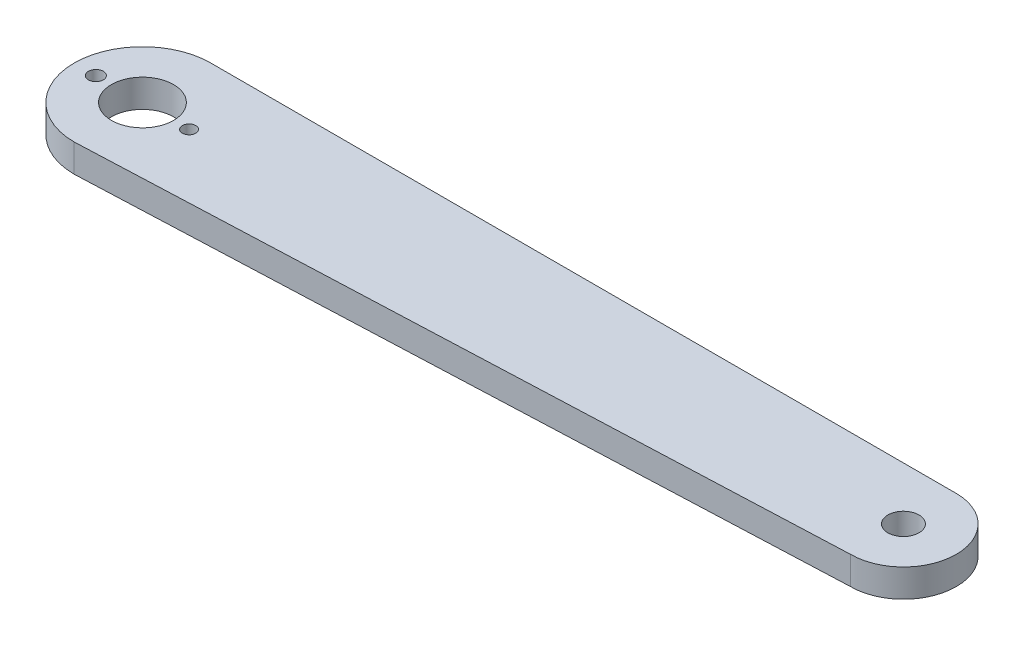
ISO-10303-21;
HEADER;
FILE_DESCRIPTION(('STEP AP214'),'2;1');
FILE_NAME('part.step','',(''),(''),'','','');
FILE_SCHEMA(('AUTOMOTIVE_DESIGN { 1 0 10303 214 1 1 1 1 }'));
ENDSEC;
DATA;
#1=APPLICATION_CONTEXT('core data for automotive mechanical design processes');
#2=APPLICATION_PROTOCOL_DEFINITION('international standard','automotive_design',2000,#1);
#3=PRODUCT_CONTEXT('',#1,'mechanical');
#4=PRODUCT('Part','Part','',(#3));
#5=PRODUCT_RELATED_PRODUCT_CATEGORY('part','',(#4));
#6=PRODUCT_DEFINITION_FORMATION('','',#4);
#7=PRODUCT_DEFINITION_CONTEXT('part definition',#1,'design');
#8=PRODUCT_DEFINITION('design','',#6,#7);
#9=PRODUCT_DEFINITION_SHAPE('','',#8);
#10=(LENGTH_UNIT() NAMED_UNIT(*) SI_UNIT(.MILLI.,.METRE.));
#11=(NAMED_UNIT(*) PLANE_ANGLE_UNIT() SI_UNIT($,.RADIAN.));
#12=(NAMED_UNIT(*) SI_UNIT($,.STERADIAN.) SOLID_ANGLE_UNIT());
#13=UNCERTAINTY_MEASURE_WITH_UNIT(LENGTH_MEASURE(1.E-05),#10,'distance_accuracy_value','');
#14=(GEOMETRIC_REPRESENTATION_CONTEXT(3) GLOBAL_UNCERTAINTY_ASSIGNED_CONTEXT((#13)) GLOBAL_UNIT_ASSIGNED_CONTEXT((#10,
#11,#12)) REPRESENTATION_CONTEXT('',''));
#15=CARTESIAN_POINT('',(0.,0.,0.));
#16=DIRECTION('',(0.,0.,1.));
#17=DIRECTION('',(1.,0.,0.));
#18=AXIS2_PLACEMENT_3D('',#15,#16,#17);
#19=CARTESIAN_POINT('',(0.,4.5,-8.5));
#20=DIRECTION('',(0.,0.,-1.));
#21=DIRECTION('',(-1.,0.,0.));
#22=AXIS2_PLACEMENT_3D('',#19,#20,#21);
#23=PLANE('',#22);
#24=DIRECTION('',(1.,0.,0.));
#25=VECTOR('',#24,1.);
#26=CARTESIAN_POINT('',(0.,0.,-8.5));
#27=LINE('',#26,#25);
#28=CARTESIAN_POINT('',(-119.973955507018,0.,-8.5));
#29=VERTEX_POINT('',#28);
#30=CARTESIAN_POINT('',(0.,0.,-8.5));
#31=VERTEX_POINT('',#30);
#32=EDGE_CURVE('E125',#29,#31,#27,.T.);
#33=ORIENTED_EDGE('',*,*,#32,.F.);
#34=DIRECTION('',(0.,-1.,0.));
#35=VECTOR('',#34,1.);
#36=CARTESIAN_POINT('',(-119.973955507018,4.5,-8.5));
#37=LINE('',#36,#35);
#38=CARTESIAN_POINT('',(-119.973955507018,4.5,-8.5));
#39=VERTEX_POINT('',#38);
#40=EDGE_CURVE('E11',#39,#29,#37,.T.);
#41=ORIENTED_EDGE('',*,*,#40,.F.);
#42=DIRECTION('',(1.,0.,0.));
#43=VECTOR('',#42,1.);
#44=CARTESIAN_POINT('',(0.,4.5,-8.5));
#45=LINE('',#44,#43);
#46=CARTESIAN_POINT('',(0.,4.5,-8.5));
#47=VERTEX_POINT('',#46);
#48=EDGE_CURVE('E93',#39,#47,#45,.T.);
#49=ORIENTED_EDGE('',*,*,#48,.T.);
#50=DIRECTION('',(0.,-1.,0.));
#51=VECTOR('',#50,1.);
#52=CARTESIAN_POINT('',(0.,4.5,-8.5));
#53=LINE('',#52,#51);
#54=EDGE_CURVE('E81',#47,#31,#53,.T.);
#55=ORIENTED_EDGE('',*,*,#54,.T.);
#56=EDGE_LOOP('',(#33,#41,#49,#55));
#57=FACE_BOUND('',#56,.T.);
#58=ADVANCED_FACE('F41',(#57),#23,.T.);
#59=CARTESIAN_POINT('',(-119.973955507018,4.5,2.5));
#60=DIRECTION('',(0.,-1.,0.));
#61=DIRECTION('',(0.,0.,-1.));
#62=AXIS2_PLACEMENT_3D('',#59,#60,#61);
#63=CYLINDRICAL_SURFACE('',#62,11.);
#64=CARTESIAN_POINT('',(-119.973955507018,0.,2.5));
#65=DIRECTION('',(0.,1.,0.));
#66=DIRECTION('',(0.,0.,1.));
#67=AXIS2_PLACEMENT_3D('',#64,#65,#66);
#68=CIRCLE('',#67,11.);
#69=CARTESIAN_POINT('',(-119.973955507018,0.,13.5));
#70=VERTEX_POINT('',#69);
#71=EDGE_CURVE('E99',#29,#70,#68,.T.);
#72=ORIENTED_EDGE('',*,*,#71,.T.);
#73=DIRECTION('',(0.,-1.,0.));
#74=VECTOR('',#73,1.);
#75=CARTESIAN_POINT('',(-119.973955507018,4.5,13.5));
#76=LINE('',#75,#74);
#77=CARTESIAN_POINT('',(-119.973955507018,4.5,13.5));
#78=VERTEX_POINT('',#77);
#79=EDGE_CURVE('E50',#78,#70,#76,.T.);
#80=ORIENTED_EDGE('',*,*,#79,.F.);
#81=CARTESIAN_POINT('',(-119.973955507018,4.5,2.5));
#82=DIRECTION('',(0.,1.,0.));
#83=DIRECTION('',(0.,0.,1.));
#84=AXIS2_PLACEMENT_3D('',#81,#82,#83);
#85=CIRCLE('',#84,11.);
#86=EDGE_CURVE('E87',#39,#78,#85,.T.);
#87=ORIENTED_EDGE('',*,*,#86,.F.);
#88=ORIENTED_EDGE('',*,*,#40,.T.);
#89=EDGE_LOOP('',(#72,#80,#87,#88));
#90=FACE_BOUND('',#89,.T.);
#91=ADVANCED_FACE('F97',(#90),#63,.T.);
#92=CARTESIAN_POINT('',(0.353629344363989,4.5,8.48526224534027));
#93=DIRECTION('',(-0.041639566392797,0.,-0.999132697148191));
#94=DIRECTION('',(-0.999132697148192,0.,0.041639566392797));
#95=AXIS2_PLACEMENT_3D('',#92,#93,#94);
#96=PLANE('',#95);
#97=DIRECTION('',(0.999132697148192,0.,-0.041639566392797));
#98=VECTOR('',#97,1.);
#99=CARTESIAN_POINT('',(0.353629344363989,0.,8.48526224534027));
#100=LINE('',#99,#98);
#101=CARTESIAN_POINT('',(0.,0.,8.5));
#102=VERTEX_POINT('',#101);
#103=EDGE_CURVE('E74',#70,#102,#100,.T.);
#104=ORIENTED_EDGE('',*,*,#103,.T.);
#105=DIRECTION('',(0.,-1.,0.));
#106=VECTOR('',#105,1.);
#107=CARTESIAN_POINT('',(0.,4.5,8.5));
#108=LINE('',#107,#106);
#109=CARTESIAN_POINT('',(0.,4.5,8.5));
#110=VERTEX_POINT('',#109);
#111=EDGE_CURVE('E101',#110,#102,#108,.T.);
#112=ORIENTED_EDGE('',*,*,#111,.F.);
#113=DIRECTION('',(0.999132697148192,0.,-0.041639566392797));
#114=VECTOR('',#113,1.);
#115=CARTESIAN_POINT('',(0.353629344363989,4.5,8.48526224534027));
#116=LINE('',#115,#114);
#117=EDGE_CURVE('E92',#78,#110,#116,.T.);
#118=ORIENTED_EDGE('',*,*,#117,.F.);
#119=ORIENTED_EDGE('',*,*,#79,.T.);
#120=EDGE_LOOP('',(#104,#112,#118,#119));
#121=FACE_BOUND('',#120,.T.);
#122=ADVANCED_FACE('F102',(#121),#96,.F.);
#123=CARTESIAN_POINT('',(-127.473955507018,4.5,2.5));
#124=DIRECTION('',(0.,-1.,0.));
#125=DIRECTION('',(0.,0.,-1.));
#126=AXIS2_PLACEMENT_3D('',#123,#124,#125);
#127=CYLINDRICAL_SURFACE('',#126,1.20122645595207);
#128=CARTESIAN_POINT('',(-127.473955507018,4.5,2.5));
#129=DIRECTION('',(0.,1.,0.));
#130=DIRECTION('',(0.,0.,1.));
#131=AXIS2_PLACEMENT_3D('',#128,#129,#130);
#132=CIRCLE('',#131,1.20122645595207);
#133=CARTESIAN_POINT('',(-127.473955507018,4.5,3.70122645595206));
#134=VERTEX_POINT('',#133);
#135=EDGE_CURVE('E117',#134,#134,#132,.T.);
#136=ORIENTED_EDGE('',*,*,#135,.T.);
#137=EDGE_LOOP('',(#136));
#138=FACE_BOUND('',#137,.T.);
#139=CARTESIAN_POINT('',(-127.473955507018,0.,2.5));
#140=DIRECTION('',(0.,1.,0.));
#141=DIRECTION('',(0.,0.,1.));
#142=AXIS2_PLACEMENT_3D('',#139,#140,#141);
#143=CIRCLE('',#142,1.20122645595207);
#144=CARTESIAN_POINT('',(-127.473955507018,0.,3.70122645595206));
#145=VERTEX_POINT('',#144);
#146=EDGE_CURVE('E144',#145,#145,#143,.T.);
#147=ORIENTED_EDGE('',*,*,#146,.F.);
#148=EDGE_LOOP('',(#147));
#149=FACE_BOUND('',#148,.T.);
#150=ADVANCED_FACE('F168',(#138,#149),#127,.F.);
#151=CARTESIAN_POINT('',(-112.473955507018,4.5,2.5));
#152=DIRECTION('',(0.,-1.,0.));
#153=DIRECTION('',(0.,0.,-1.));
#154=AXIS2_PLACEMENT_3D('',#151,#152,#153);
#155=CYLINDRICAL_SURFACE('',#154,1.07615518893283);
#156=CARTESIAN_POINT('',(-112.473955507018,4.5,2.5));
#157=DIRECTION('',(0.,1.,0.));
#158=DIRECTION('',(0.,0.,1.));
#159=AXIS2_PLACEMENT_3D('',#156,#157,#158);
#160=CIRCLE('',#159,1.07615518893283);
#161=CARTESIAN_POINT('',(-112.473955507018,4.5,3.57615518893283));
#162=VERTEX_POINT('',#161);
#163=EDGE_CURVE('E113',#162,#162,#160,.T.);
#164=ORIENTED_EDGE('',*,*,#163,.T.);
#165=EDGE_LOOP('',(#164));
#166=FACE_BOUND('',#165,.T.);
#167=CARTESIAN_POINT('',(-112.473955507018,0.,2.5));
#168=DIRECTION('',(0.,1.,0.));
#169=DIRECTION('',(0.,0.,1.));
#170=AXIS2_PLACEMENT_3D('',#167,#168,#169);
#171=CIRCLE('',#170,1.07615518893283);
#172=CARTESIAN_POINT('',(-112.473955507018,0.,3.57615518893283));
#173=VERTEX_POINT('',#172);
#174=EDGE_CURVE('E140',#173,#173,#171,.T.);
#175=ORIENTED_EDGE('',*,*,#174,.F.);
#176=EDGE_LOOP('',(#175));
#177=FACE_BOUND('',#176,.T.);
#178=ADVANCED_FACE('F177',(#166,#177),#155,.F.);
#179=CARTESIAN_POINT('',(0.,4.5,0.));
#180=DIRECTION('',(0.,-1.,0.));
#181=DIRECTION('',(0.,0.,-1.));
#182=AXIS2_PLACEMENT_3D('',#179,#180,#181);
#183=CYLINDRICAL_SURFACE('',#182,2.5);
#184=CARTESIAN_POINT('',(0.,4.5,0.));
#185=DIRECTION('',(0.,1.,0.));
#186=DIRECTION('',(0.,0.,1.));
#187=AXIS2_PLACEMENT_3D('',#184,#185,#186);
#188=CIRCLE('',#187,2.5);
#189=CARTESIAN_POINT('',(0.,4.5,2.5));
#190=VERTEX_POINT('',#189);
#191=EDGE_CURVE('E106',#190,#190,#188,.T.);
#192=ORIENTED_EDGE('',*,*,#191,.T.);
#193=EDGE_LOOP('',(#192));
#194=FACE_BOUND('',#193,.T.);
#195=CARTESIAN_POINT('',(0.,0.,0.));
#196=DIRECTION('',(0.,1.,0.));
#197=DIRECTION('',(0.,0.,1.));
#198=AXIS2_PLACEMENT_3D('',#195,#196,#197);
#199=CIRCLE('',#198,2.5);
#200=CARTESIAN_POINT('',(0.,0.,2.5));
#201=VERTEX_POINT('',#200);
#202=EDGE_CURVE('E136',#201,#201,#199,.T.);
#203=ORIENTED_EDGE('',*,*,#202,.F.);
#204=EDGE_LOOP('',(#203));
#205=FACE_BOUND('',#204,.T.);
#206=ADVANCED_FACE('F174',(#194,#205),#183,.F.);
#207=CARTESIAN_POINT('',(0.,4.5,0.));
#208=DIRECTION('',(0.,-1.,0.));
#209=DIRECTION('',(0.,0.,-1.));
#210=AXIS2_PLACEMENT_3D('',#207,#208,#209);
#211=CYLINDRICAL_SURFACE('',#210,8.5);
#212=CARTESIAN_POINT('',(0.,0.,0.));
#213=DIRECTION('',(0.,1.,0.));
#214=DIRECTION('',(0.,0.,1.));
#215=AXIS2_PLACEMENT_3D('',#212,#213,#214);
#216=CIRCLE('',#215,8.5);
#217=EDGE_CURVE('E133',#102,#31,#216,.T.);
#218=ORIENTED_EDGE('',*,*,#217,.T.);
#219=ORIENTED_EDGE('',*,*,#54,.F.);
#220=CARTESIAN_POINT('',(0.,4.5,0.));
#221=DIRECTION('',(0.,1.,0.));
#222=DIRECTION('',(0.,0.,1.));
#223=AXIS2_PLACEMENT_3D('',#220,#221,#222);
#224=CIRCLE('',#223,8.5);
#225=EDGE_CURVE('E58',#110,#47,#224,.T.);
#226=ORIENTED_EDGE('',*,*,#225,.F.);
#227=ORIENTED_EDGE('',*,*,#111,.T.);
#228=EDGE_LOOP('',(#218,#219,#226,#227));
#229=FACE_BOUND('',#228,.T.);
#230=ADVANCED_FACE('F157',(#229),#211,.T.);
#231=CARTESIAN_POINT('',(-119.973955507018,4.5,2.5));
#232=DIRECTION('',(0.,-1.,0.));
#233=DIRECTION('',(0.,0.,-1.));
#234=AXIS2_PLACEMENT_3D('',#231,#232,#233);
#235=CYLINDRICAL_SURFACE('',#234,5.);
#236=CARTESIAN_POINT('',(-119.973955507018,4.5,2.5));
#237=DIRECTION('',(0.,1.,0.));
#238=DIRECTION('',(0.,0.,1.));
#239=AXIS2_PLACEMENT_3D('',#236,#237,#238);
#240=CIRCLE('',#239,5.);
#241=CARTESIAN_POINT('',(-119.973955507018,4.5,7.5));
#242=VERTEX_POINT('',#241);
#243=EDGE_CURVE('E121',#242,#242,#240,.T.);
#244=ORIENTED_EDGE('',*,*,#243,.T.);
#245=EDGE_LOOP('',(#244));
#246=FACE_BOUND('',#245,.T.);
#247=CARTESIAN_POINT('',(-119.973955507018,0.,2.5));
#248=DIRECTION('',(0.,1.,0.));
#249=DIRECTION('',(0.,0.,1.));
#250=AXIS2_PLACEMENT_3D('',#247,#248,#249);
#251=CIRCLE('',#250,5.);
#252=CARTESIAN_POINT('',(-119.973955507018,0.,7.5));
#253=VERTEX_POINT('',#252);
#254=EDGE_CURVE('E148',#253,#253,#251,.T.);
#255=ORIENTED_EDGE('',*,*,#254,.F.);
#256=EDGE_LOOP('',(#255));
#257=FACE_BOUND('',#256,.T.);
#258=ADVANCED_FACE('F173',(#246,#257),#235,.F.);
#259=CARTESIAN_POINT('',(0.,4.5,0.));
#260=DIRECTION('',(0.,1.,0.));
#261=DIRECTION('',(0.,0.,1.));
#262=AXIS2_PLACEMENT_3D('',#259,#260,#261);
#263=PLANE('',#262);
#264=ORIENTED_EDGE('',*,*,#48,.F.);
#265=ORIENTED_EDGE('',*,*,#86,.T.);
#266=ORIENTED_EDGE('',*,*,#117,.T.);
#267=ORIENTED_EDGE('',*,*,#225,.T.);
#268=EDGE_LOOP('',(#264,#265,#266,#267));
#269=FACE_BOUND('',#268,.T.);
#270=ORIENTED_EDGE('',*,*,#191,.F.);
#271=EDGE_LOOP('',(#270));
#272=FACE_BOUND('',#271,.T.);
#273=ORIENTED_EDGE('',*,*,#163,.F.);
#274=EDGE_LOOP('',(#273));
#275=FACE_BOUND('',#274,.T.);
#276=ORIENTED_EDGE('',*,*,#135,.F.);
#277=EDGE_LOOP('',(#276));
#278=FACE_BOUND('',#277,.T.);
#279=ORIENTED_EDGE('',*,*,#243,.F.);
#280=EDGE_LOOP('',(#279));
#281=FACE_BOUND('',#280,.T.);
#282=ADVANCED_FACE('F89',(#269,#272,#275,#278,#281),#263,.T.);
#283=CARTESIAN_POINT('',(0.,0.,0.));
#284=DIRECTION('',(0.,1.,0.));
#285=DIRECTION('',(0.,0.,1.));
#286=AXIS2_PLACEMENT_3D('',#283,#284,#285);
#287=PLANE('',#286);
#288=ORIENTED_EDGE('',*,*,#32,.T.);
#289=ORIENTED_EDGE('',*,*,#217,.F.);
#290=ORIENTED_EDGE('',*,*,#103,.F.);
#291=ORIENTED_EDGE('',*,*,#71,.F.);
#292=EDGE_LOOP('',(#288,#289,#290,#291));
#293=FACE_BOUND('',#292,.T.);
#294=ORIENTED_EDGE('',*,*,#202,.T.);
#295=EDGE_LOOP('',(#294));
#296=FACE_BOUND('',#295,.T.);
#297=ORIENTED_EDGE('',*,*,#174,.T.);
#298=EDGE_LOOP('',(#297));
#299=FACE_BOUND('',#298,.T.);
#300=ORIENTED_EDGE('',*,*,#146,.T.);
#301=EDGE_LOOP('',(#300));
#302=FACE_BOUND('',#301,.T.);
#303=ORIENTED_EDGE('',*,*,#254,.T.);
#304=EDGE_LOOP('',(#303));
#305=FACE_BOUND('',#304,.T.);
#306=ADVANCED_FACE('F159',(#293,#296,#299,#302,#305),#287,.F.);
#307=CLOSED_SHELL('',(#58,#91,#122,#150,#178,#206,#230,#258,#282,#306));
#308=MANIFOLD_SOLID_BREP('B2',#307);
#309=ADVANCED_BREP_SHAPE_REPRESENTATION('',(#18,#308),#14);
#310=SHAPE_DEFINITION_REPRESENTATION(#9,#309);
ENDSEC;
END-ISO-10303-21;
